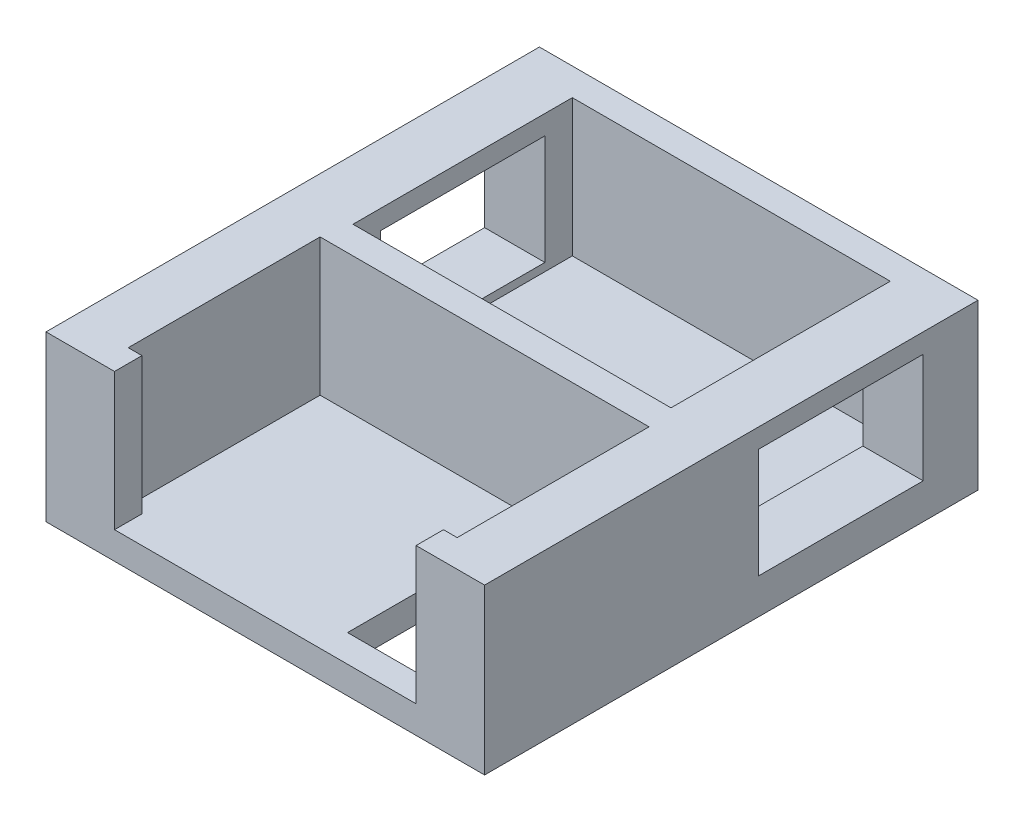
ISO-10303-21;
HEADER;
FILE_DESCRIPTION(('STEP AP214'),'2;1');
FILE_NAME('part.step','',(''),(''),'','','');
FILE_SCHEMA(('AUTOMOTIVE_DESIGN { 1 0 10303 214 1 1 1 1 }'));
ENDSEC;
DATA;
#1=APPLICATION_CONTEXT('core data for automotive mechanical design processes');
#2=APPLICATION_PROTOCOL_DEFINITION('international standard','automotive_design',2000,#1);
#3=PRODUCT_CONTEXT('',#1,'mechanical');
#4=PRODUCT('Part','Part','',(#3));
#5=PRODUCT_RELATED_PRODUCT_CATEGORY('part','',(#4));
#6=PRODUCT_DEFINITION_FORMATION('','',#4);
#7=PRODUCT_DEFINITION_CONTEXT('part definition',#1,'design');
#8=PRODUCT_DEFINITION('design','',#6,#7);
#9=PRODUCT_DEFINITION_SHAPE('','',#8);
#10=(LENGTH_UNIT() NAMED_UNIT(*) SI_UNIT(.MILLI.,.METRE.));
#11=(NAMED_UNIT(*) PLANE_ANGLE_UNIT() SI_UNIT($,.RADIAN.));
#12=(NAMED_UNIT(*) SI_UNIT($,.STERADIAN.) SOLID_ANGLE_UNIT());
#13=UNCERTAINTY_MEASURE_WITH_UNIT(LENGTH_MEASURE(1.E-05),#10,'distance_accuracy_value','');
#14=(GEOMETRIC_REPRESENTATION_CONTEXT(3) GLOBAL_UNCERTAINTY_ASSIGNED_CONTEXT((#13)) GLOBAL_UNIT_ASSIGNED_CONTEXT((#10,
#11,#12)) REPRESENTATION_CONTEXT('',''));
#15=CARTESIAN_POINT('',(0.,0.,0.));
#16=DIRECTION('',(0.,0.,1.));
#17=DIRECTION('',(1.,0.,0.));
#18=AXIS2_PLACEMENT_3D('',#15,#16,#17);
#19=CARTESIAN_POINT('',(32.3529411764706,30.,80.7124020072625));
#20=DIRECTION('',(0.,0.,-1.));
#21=DIRECTION('',(-1.,0.,0.));
#22=AXIS2_PLACEMENT_3D('',#19,#20,#21);
#23=PLANE('',#22);
#24=DIRECTION('',(0.,-1.,0.));
#25=VECTOR('',#24,1.);
#26=CARTESIAN_POINT('',(29.8529411764706,30.,80.7124020072625));
#27=LINE('',#26,#25);
#28=CARTESIAN_POINT('',(29.8529411764706,30.,80.7124020072625));
#29=VERTEX_POINT('',#28);
#30=CARTESIAN_POINT('',(29.8529411764706,5.,80.7124020072625));
#31=VERTEX_POINT('',#30);
#32=EDGE_CURVE('E12',#29,#31,#27,.T.);
#33=ORIENTED_EDGE('',*,*,#32,.F.);
#34=DIRECTION('',(1.,0.,0.));
#35=VECTOR('',#34,1.);
#36=CARTESIAN_POINT('',(32.3529411764706,30.,80.7124020072625));
#37=LINE('',#36,#35);
#38=CARTESIAN_POINT('',(32.3529411764706,30.,80.7124020072625));
#39=VERTEX_POINT('',#38);
#40=EDGE_CURVE('E235',#29,#39,#37,.T.);
#41=ORIENTED_EDGE('',*,*,#40,.T.);
#42=DIRECTION('',(0.,-1.,0.));
#43=VECTOR('',#42,1.);
#44=CARTESIAN_POINT('',(32.3529411764706,30.,80.7124020072625));
#45=LINE('',#44,#43);
#46=CARTESIAN_POINT('',(32.3529411764706,0.,80.7124020072625));
#47=VERTEX_POINT('',#46);
#48=EDGE_CURVE('E381',#39,#47,#45,.T.);
#49=ORIENTED_EDGE('',*,*,#48,.T.);
#50=DIRECTION('',(1.,0.,0.));
#51=VECTOR('',#50,1.);
#52=CARTESIAN_POINT('',(32.3529411764706,0.,80.7124020072625));
#53=LINE('',#52,#51);
#54=CARTESIAN_POINT('',(12.3529411764706,0.,80.7124020072625));
#55=VERTEX_POINT('',#54);
#56=EDGE_CURVE('E529',#55,#47,#53,.T.);
#57=ORIENTED_EDGE('',*,*,#56,.F.);
#58=DIRECTION('',(0.,1.,0.));
#59=VECTOR('',#58,1.);
#60=CARTESIAN_POINT('',(12.3529411764706,0.,80.7124020072625));
#61=LINE('',#60,#59);
#62=CARTESIAN_POINT('',(12.3529411764706,5.,80.7124020072625));
#63=VERTEX_POINT('',#62);
#64=EDGE_CURVE('E535',#55,#63,#61,.T.);
#65=ORIENTED_EDGE('',*,*,#64,.T.);
#66=DIRECTION('',(-1.,0.,0.));
#67=VECTOR('',#66,1.);
#68=CARTESIAN_POINT('',(32.3529411764706,5.,80.7124020072625));
#69=LINE('',#68,#67);
#70=EDGE_CURVE('E499',#31,#63,#69,.T.);
#71=ORIENTED_EDGE('',*,*,#70,.F.);
#72=EDGE_LOOP('',(#33,#41,#49,#57,#65,#71));
#73=FACE_BOUND('',#72,.T.);
#74=ADVANCED_FACE('F41',(#73),#23,.T.);
#75=CARTESIAN_POINT('',(0.,5.,0.));
#76=DIRECTION('',(0.,1.,0.));
#77=DIRECTION('',(0.,0.,1.));
#78=AXIS2_PLACEMENT_3D('',#75,#76,#77);
#79=PLANE('',#78);
#80=CARTESIAN_POINT('',(16.3529411764706,5.,25.7124020072625));
#81=DIRECTION('',(0.,1.,0.));
#82=DIRECTION('',(0.,0.,1.));
#83=AXIS2_PLACEMENT_3D('',#80,#81,#82);
#84=CIRCLE('',#83,10.);
#85=CARTESIAN_POINT('',(16.3529411764706,5.,35.7124020072625));
#86=VERTEX_POINT('',#85);
#87=EDGE_CURVE('E259',#86,#86,#84,.T.);
#88=ORIENTED_EDGE('',*,*,#87,.F.);
#89=EDGE_LOOP('',(#88));
#90=FACE_BOUND('',#89,.T.);
#91=DIRECTION('',(-1.,0.,0.));
#92=VECTOR('',#91,1.);
#93=CARTESIAN_POINT('',(-26.6470588235294,5.,0.712402007262518));
#94=LINE('',#93,#92);
#95=CARTESIAN_POINT('',(31.3529411764706,5.,0.712402007262518));
#96=VERTEX_POINT('',#95);
#97=CARTESIAN_POINT('',(-26.6470588235294,5.,0.712402007262518));
#98=VERTEX_POINT('',#97);
#99=EDGE_CURVE('E408',#96,#98,#94,.T.);
#100=ORIENTED_EDGE('',*,*,#99,.T.);
#101=DIRECTION('',(0.,0.,1.));
#102=VECTOR('',#101,1.);
#103=CARTESIAN_POINT('',(-26.6470588235294,5.,0.712402007262518));
#104=LINE('',#103,#102);
#105=CARTESIAN_POINT('',(-26.6470588235294,5.,40.7124020072625));
#106=VERTEX_POINT('',#105);
#107=EDGE_CURVE('E403',#98,#106,#104,.T.);
#108=ORIENTED_EDGE('',*,*,#107,.T.);
#109=DIRECTION('',(1.,0.,0.));
#110=VECTOR('',#109,1.);
#111=CARTESIAN_POINT('',(-26.6470588235294,5.,40.7124020072625));
#112=LINE('',#111,#110);
#113=CARTESIAN_POINT('',(31.3529411764706,5.,40.7124020072625));
#114=VERTEX_POINT('',#113);
#115=EDGE_CURVE('E422',#106,#114,#112,.T.);
#116=ORIENTED_EDGE('',*,*,#115,.T.);
#117=DIRECTION('',(0.,0.,-1.));
#118=VECTOR('',#117,1.);
#119=CARTESIAN_POINT('',(31.3529411764706,5.,0.712402007262518));
#120=LINE('',#119,#118);
#121=EDGE_CURVE('E426',#114,#96,#120,.T.);
#122=ORIENTED_EDGE('',*,*,#121,.T.);
#123=EDGE_LOOP('',(#100,#108,#116,#122));
#124=FACE_BOUND('',#123,.T.);
#125=ADVANCED_FACE('F451',(#90,#124),#79,.T.);
#126=CARTESIAN_POINT('',(0.,0.,0.));
#127=DIRECTION('',(0.,1.,0.));
#128=DIRECTION('',(0.,0.,1.));
#129=AXIS2_PLACEMENT_3D('',#126,#127,#128);
#130=PLANE('',#129);
#131=ORIENTED_EDGE('',*,*,#56,.T.);
#132=DIRECTION('',(0.,0.,-1.));
#133=VECTOR('',#132,1.);
#134=CARTESIAN_POINT('',(32.3529411764706,0.,45.7124020072625));
#135=LINE('',#134,#133);
#136=CARTESIAN_POINT('',(32.3529411764706,0.,45.7124020072625));
#137=VERTEX_POINT('',#136);
#138=EDGE_CURVE('E517',#47,#137,#135,.T.);
#139=ORIENTED_EDGE('',*,*,#138,.T.);
#140=DIRECTION('',(-1.,0.,0.));
#141=VECTOR('',#140,1.);
#142=CARTESIAN_POINT('',(32.3529411764706,0.,45.7124020072625));
#143=LINE('',#142,#141);
#144=CARTESIAN_POINT('',(12.3529411764706,0.,45.7124020072625));
#145=VERTEX_POINT('',#144);
#146=EDGE_CURVE('E521',#137,#145,#143,.T.);
#147=ORIENTED_EDGE('',*,*,#146,.T.);
#148=DIRECTION('',(0.,0.,1.));
#149=VECTOR('',#148,1.);
#150=CARTESIAN_POINT('',(12.3529411764706,0.,45.7124020072625));
#151=LINE('',#150,#149);
#152=EDGE_CURVE('E525',#145,#55,#151,.T.);
#153=ORIENTED_EDGE('',*,*,#152,.T.);
#154=EDGE_LOOP('',(#131,#139,#147,#153));
#155=FACE_BOUND('',#154,.T.);
#156=DIRECTION('',(0.,0.,1.));
#157=VECTOR('',#156,1.);
#158=CARTESIAN_POINT('',(-37.6470588235294,0.,-14.2875979927375));
#159=LINE('',#158,#157);
#160=CARTESIAN_POINT('',(-37.6470588235294,0.,-4.28759799273748));
#161=VERTEX_POINT('',#160);
#162=CARTESIAN_POINT('',(-37.6470588235294,0.,85.7124020072625));
#163=VERTEX_POINT('',#162);
#164=EDGE_CURVE('E263',#161,#163,#159,.T.);
#165=ORIENTED_EDGE('',*,*,#164,.F.);
#166=DIRECTION('',(1.,0.,0.));
#167=VECTOR('',#166,1.);
#168=CARTESIAN_POINT('',(-37.6470588235294,0.,-4.28759799273748));
#169=LINE('',#168,#167);
#170=CARTESIAN_POINT('',(42.3529411764706,0.,-4.28759799273749));
#171=VERTEX_POINT('',#170);
#172=EDGE_CURVE('E352',#161,#171,#169,.T.);
#173=ORIENTED_EDGE('',*,*,#172,.T.);
#174=DIRECTION('',(0.,0.,-1.));
#175=VECTOR('',#174,1.);
#176=CARTESIAN_POINT('',(42.3529411764706,0.,-14.2875979927375));
#177=LINE('',#176,#175);
#178=CARTESIAN_POINT('',(42.3529411764706,0.,85.7124020072625));
#179=VERTEX_POINT('',#178);
#180=EDGE_CURVE('E272',#179,#171,#177,.T.);
#181=ORIENTED_EDGE('',*,*,#180,.F.);
#182=DIRECTION('',(1.,0.,0.));
#183=VECTOR('',#182,1.);
#184=CARTESIAN_POINT('',(-37.6470588235294,0.,85.7124020072625));
#185=LINE('',#184,#183);
#186=EDGE_CURVE('E269',#163,#179,#185,.T.);
#187=ORIENTED_EDGE('',*,*,#186,.F.);
#188=EDGE_LOOP('',(#165,#173,#181,#187));
#189=FACE_BOUND('',#188,.T.);
#190=CARTESIAN_POINT('',(16.3529411764706,0.,25.7124020072625));
#191=DIRECTION('',(0.,1.,0.));
#192=DIRECTION('',(0.,0.,1.));
#193=AXIS2_PLACEMENT_3D('',#190,#191,#192);
#194=CIRCLE('',#193,10.);
#195=CARTESIAN_POINT('',(16.3529411764706,0.,35.7124020072625));
#196=VERTEX_POINT('',#195);
#197=EDGE_CURVE('E258',#196,#196,#194,.T.);
#198=ORIENTED_EDGE('',*,*,#197,.T.);
#199=EDGE_LOOP('',(#198));
#200=FACE_BOUND('',#199,.T.);
#201=ADVANCED_FACE('F476',(#155,#189,#200),#130,.F.);
#202=CARTESIAN_POINT('',(-37.6470588235294,5.,-14.2875979927375));
#203=DIRECTION('',(1.,0.,0.));
#204=DIRECTION('',(0.,0.,-1.));
#205=AXIS2_PLACEMENT_3D('',#202,#203,#204);
#206=PLANE('',#205);
#207=DIRECTION('',(0.,0.,1.));
#208=VECTOR('',#207,1.);
#209=CARTESIAN_POINT('',(-37.6470588235294,26.4657660728318,35.7124020072625));
#210=LINE('',#209,#208);
#211=CARTESIAN_POINT('',(-37.6470588235294,26.4657660728318,5.71240200726252));
#212=VERTEX_POINT('',#211);
#213=CARTESIAN_POINT('',(-37.6470588235294,26.4657660728318,35.7124020072625));
#214=VERTEX_POINT('',#213);
#215=EDGE_CURVE('E554',#212,#214,#210,.T.);
#216=ORIENTED_EDGE('',*,*,#215,.T.);
#217=DIRECTION('',(0.,-1.,0.));
#218=VECTOR('',#217,1.);
#219=CARTESIAN_POINT('',(-37.6470588235294,26.4657660728318,35.7124020072625));
#220=LINE('',#219,#218);
#221=CARTESIAN_POINT('',(-37.6470588235294,6.4657660728318,35.7124020072625));
#222=VERTEX_POINT('',#221);
#223=EDGE_CURVE('E542',#214,#222,#220,.T.);
#224=ORIENTED_EDGE('',*,*,#223,.T.);
#225=DIRECTION('',(0.,0.,-1.));
#226=VECTOR('',#225,1.);
#227=CARTESIAN_POINT('',(-37.6470588235294,6.4657660728318,35.7124020072625));
#228=LINE('',#227,#226);
#229=CARTESIAN_POINT('',(-37.6470588235294,6.4657660728318,5.71240200726251));
#230=VERTEX_POINT('',#229);
#231=EDGE_CURVE('E546',#222,#230,#228,.T.);
#232=ORIENTED_EDGE('',*,*,#231,.T.);
#233=DIRECTION('',(0.,1.,0.));
#234=VECTOR('',#233,1.);
#235=CARTESIAN_POINT('',(-37.6470588235294,26.4657660728318,5.71240200726252));
#236=LINE('',#235,#234);
#237=EDGE_CURVE('E550',#230,#212,#236,.T.);
#238=ORIENTED_EDGE('',*,*,#237,.T.);
#239=EDGE_LOOP('',(#216,#224,#232,#238));
#240=FACE_BOUND('',#239,.T.);
#241=DIRECTION('',(0.,0.,1.));
#242=VECTOR('',#241,1.);
#243=CARTESIAN_POINT('',(-37.6470588235294,30.,-14.2875979927375));
#244=LINE('',#243,#242);
#245=CARTESIAN_POINT('',(-37.6470588235294,30.,-4.28759799273748));
#246=VERTEX_POINT('',#245);
#247=CARTESIAN_POINT('',(-37.6470588235294,30.,85.7124020072625));
#248=VERTEX_POINT('',#247);
#249=EDGE_CURVE('E246',#246,#248,#244,.T.);
#250=ORIENTED_EDGE('',*,*,#249,.F.);
#251=DIRECTION('',(0.,1.,0.));
#252=VECTOR('',#251,1.);
#253=CARTESIAN_POINT('',(-37.6470588235294,0.,-4.28759799273748));
#254=LINE('',#253,#252);
#255=EDGE_CURVE('E356',#161,#246,#254,.T.);
#256=ORIENTED_EDGE('',*,*,#255,.F.);
#257=ORIENTED_EDGE('',*,*,#164,.T.);
#258=DIRECTION('',(0.,-1.,0.));
#259=VECTOR('',#258,1.);
#260=CARTESIAN_POINT('',(-37.6470588235294,5.,85.7124020072625));
#261=LINE('',#260,#259);
#262=EDGE_CURVE('E278',#248,#163,#261,.T.);
#263=ORIENTED_EDGE('',*,*,#262,.F.);
#264=EDGE_LOOP('',(#250,#256,#257,#263));
#265=FACE_BOUND('',#264,.T.);
#266=ADVANCED_FACE('F43',(#240,#265),#206,.F.);
#267=CARTESIAN_POINT('',(-37.6470588235294,5.,85.7124020072625));
#268=DIRECTION('',(0.,0.,-1.));
#269=DIRECTION('',(-1.,0.,0.));
#270=AXIS2_PLACEMENT_3D('',#267,#268,#269);
#271=PLANE('',#270);
#272=DIRECTION('',(1.,0.,0.));
#273=VECTOR('',#272,1.);
#274=CARTESIAN_POINT('',(-37.6470588235294,30.,85.7124020072625));
#275=LINE('',#274,#273);
#276=CARTESIAN_POINT('',(29.8529411764706,30.,85.7124020072625));
#277=VERTEX_POINT('',#276);
#278=CARTESIAN_POINT('',(42.3529411764706,30.,85.7124020072625));
#279=VERTEX_POINT('',#278);
#280=EDGE_CURVE('E232',#277,#279,#275,.T.);
#281=ORIENTED_EDGE('',*,*,#280,.F.);
#282=DIRECTION('',(0.,1.,0.));
#283=VECTOR('',#282,1.);
#284=CARTESIAN_POINT('',(29.8529411764706,30.,85.7124020072625));
#285=LINE('',#284,#283);
#286=CARTESIAN_POINT('',(29.8529411764706,5.,85.7124020072625));
#287=VERTEX_POINT('',#286);
#288=EDGE_CURVE('E213',#287,#277,#285,.T.);
#289=ORIENTED_EDGE('',*,*,#288,.F.);
#290=DIRECTION('',(1.,0.,0.));
#291=VECTOR('',#290,1.);
#292=CARTESIAN_POINT('',(29.8529411764706,5.,85.7124020072625));
#293=LINE('',#292,#291);
#294=CARTESIAN_POINT('',(-25.1470588235294,4.99999999999999,85.7124020072625));
#295=VERTEX_POINT('',#294);
#296=EDGE_CURVE('E238',#295,#287,#293,.T.);
#297=ORIENTED_EDGE('',*,*,#296,.F.);
#298=DIRECTION('',(0.,-1.,0.));
#299=VECTOR('',#298,1.);
#300=CARTESIAN_POINT('',(-25.1470588235294,30.,85.7124020072625));
#301=LINE('',#300,#299);
#302=CARTESIAN_POINT('',(-25.1470588235294,30.,85.7124020072625));
#303=VERTEX_POINT('',#302);
#304=EDGE_CURVE('E225',#303,#295,#301,.T.);
#305=ORIENTED_EDGE('',*,*,#304,.F.);
#306=EDGE_CURVE('E245',#248,#303,#275,.T.);
#307=ORIENTED_EDGE('',*,*,#306,.F.);
#308=ORIENTED_EDGE('',*,*,#262,.T.);
#309=ORIENTED_EDGE('',*,*,#186,.T.);
#310=DIRECTION('',(0.,-1.,0.));
#311=VECTOR('',#310,1.);
#312=CARTESIAN_POINT('',(42.3529411764706,5.,85.7124020072625));
#313=LINE('',#312,#311);
#314=EDGE_CURVE('E242',#279,#179,#313,.T.);
#315=ORIENTED_EDGE('',*,*,#314,.F.);
#316=EDGE_LOOP('',(#281,#289,#297,#305,#307,#308,#309,#315));
#317=FACE_BOUND('',#316,.T.);
#318=ADVANCED_FACE('F240',(#317),#271,.F.);
#319=CARTESIAN_POINT('',(42.3529411764706,5.,-14.2875979927375));
#320=DIRECTION('',(-1.,0.,0.));
#321=DIRECTION('',(0.,0.,1.));
#322=AXIS2_PLACEMENT_3D('',#319,#320,#321);
#323=PLANE('',#322);
#324=DIRECTION('',(0.,0.,-1.));
#325=VECTOR('',#324,1.);
#326=CARTESIAN_POINT('',(42.3529411764706,6.4657660728318,35.7124020072625));
#327=LINE('',#326,#325);
#328=CARTESIAN_POINT('',(42.3529411764706,6.4657660728318,35.7124020072625));
#329=VERTEX_POINT('',#328);
#330=CARTESIAN_POINT('',(42.3529411764706,6.4657660728318,5.71240200726251));
#331=VERTEX_POINT('',#330);
#332=EDGE_CURVE('E560',#329,#331,#327,.T.);
#333=ORIENTED_EDGE('',*,*,#332,.F.);
#334=DIRECTION('',(0.,-1.,0.));
#335=VECTOR('',#334,1.);
#336=CARTESIAN_POINT('',(42.3529411764706,26.4657660728318,35.7124020072625));
#337=LINE('',#336,#335);
#338=CARTESIAN_POINT('',(42.3529411764706,26.4657660728318,35.7124020072625));
#339=VERTEX_POINT('',#338);
#340=EDGE_CURVE('E539',#339,#329,#337,.T.);
#341=ORIENTED_EDGE('',*,*,#340,.F.);
#342=DIRECTION('',(0.,0.,1.));
#343=VECTOR('',#342,1.);
#344=CARTESIAN_POINT('',(42.3529411764706,26.4657660728318,35.7124020072625));
#345=LINE('',#344,#343);
#346=CARTESIAN_POINT('',(42.3529411764706,26.4657660728318,5.71240200726251));
#347=VERTEX_POINT('',#346);
#348=EDGE_CURVE('E308',#347,#339,#345,.T.);
#349=ORIENTED_EDGE('',*,*,#348,.F.);
#350=DIRECTION('',(0.,1.,0.));
#351=VECTOR('',#350,1.);
#352=CARTESIAN_POINT('',(42.3529411764706,26.4657660728318,5.71240200726251));
#353=LINE('',#352,#351);
#354=EDGE_CURVE('E324',#331,#347,#353,.T.);
#355=ORIENTED_EDGE('',*,*,#354,.F.);
#356=EDGE_LOOP('',(#333,#341,#349,#355));
#357=FACE_BOUND('',#356,.T.);
#358=ORIENTED_EDGE('',*,*,#180,.T.);
#359=DIRECTION('',(0.,1.,0.));
#360=VECTOR('',#359,1.);
#361=CARTESIAN_POINT('',(42.3529411764706,0.,-4.28759799273749));
#362=LINE('',#361,#360);
#363=CARTESIAN_POINT('',(42.3529411764706,30.,-4.28759799273749));
#364=VERTEX_POINT('',#363);
#365=EDGE_CURVE('E359',#171,#364,#362,.T.);
#366=ORIENTED_EDGE('',*,*,#365,.T.);
#367=DIRECTION('',(0.,0.,-1.));
#368=VECTOR('',#367,1.);
#369=CARTESIAN_POINT('',(42.3529411764706,30.,-14.2875979927375));
#370=LINE('',#369,#368);
#371=EDGE_CURVE('E251',#279,#364,#370,.T.);
#372=ORIENTED_EDGE('',*,*,#371,.F.);
#373=ORIENTED_EDGE('',*,*,#314,.T.);
#374=EDGE_LOOP('',(#358,#366,#372,#373));
#375=FACE_BOUND('',#374,.T.);
#376=ADVANCED_FACE('F630',(#357,#375),#323,.F.);
#377=CARTESIAN_POINT('',(16.3529411764706,5.,25.7124020072625));
#378=DIRECTION('',(0.,-1.,0.));
#379=DIRECTION('',(0.,0.,-1.));
#380=AXIS2_PLACEMENT_3D('',#377,#378,#379);
#381=CYLINDRICAL_SURFACE('',#380,10.);
#382=ORIENTED_EDGE('',*,*,#87,.T.);
#383=EDGE_LOOP('',(#382));
#384=FACE_BOUND('',#383,.T.);
#385=ORIENTED_EDGE('',*,*,#197,.F.);
#386=EDGE_LOOP('',(#385));
#387=FACE_BOUND('',#386,.T.);
#388=ADVANCED_FACE('F649',(#384,#387),#381,.F.);
#389=CARTESIAN_POINT('',(0.,30.,0.));
#390=DIRECTION('',(0.,1.,0.));
#391=DIRECTION('',(0.,0.,1.));
#392=AXIS2_PLACEMENT_3D('',#389,#390,#391);
#393=PLANE('',#392);
#394=DIRECTION('',(0.,0.,1.));
#395=VECTOR('',#394,1.);
#396=CARTESIAN_POINT('',(29.8529411764706,30.,75.7124020072625));
#397=LINE('',#396,#395);
#398=EDGE_CURVE('E216',#29,#277,#397,.T.);
#399=ORIENTED_EDGE('',*,*,#398,.T.);
#400=ORIENTED_EDGE('',*,*,#280,.T.);
#401=ORIENTED_EDGE('',*,*,#371,.T.);
#402=DIRECTION('',(1.,0.,0.));
#403=VECTOR('',#402,1.);
#404=CARTESIAN_POINT('',(-37.6470588235294,30.,-4.28759799273748));
#405=LINE('',#404,#403);
#406=EDGE_CURVE('E351',#246,#364,#405,.T.);
#407=ORIENTED_EDGE('',*,*,#406,.F.);
#408=ORIENTED_EDGE('',*,*,#249,.T.);
#409=ORIENTED_EDGE('',*,*,#306,.T.);
#410=DIRECTION('',(0.,0.,1.));
#411=VECTOR('',#410,1.);
#412=CARTESIAN_POINT('',(-25.1470588235294,30.,75.7124020072625));
#413=LINE('',#412,#411);
#414=CARTESIAN_POINT('',(-25.1470588235294,30.,80.7124020072625));
#415=VERTEX_POINT('',#414);
#416=EDGE_CURVE('E237',#415,#303,#413,.T.);
#417=ORIENTED_EDGE('',*,*,#416,.F.);
#418=CARTESIAN_POINT('',(-27.6470588235294,30.,80.7124020072625));
#419=VERTEX_POINT('',#418);
#420=EDGE_CURVE('E377',#419,#415,#37,.T.);
#421=ORIENTED_EDGE('',*,*,#420,.F.);
#422=DIRECTION('',(0.,0.,1.));
#423=VECTOR('',#422,1.);
#424=CARTESIAN_POINT('',(-27.6470588235294,30.,45.7124020072625));
#425=LINE('',#424,#423);
#426=CARTESIAN_POINT('',(-27.6470588235294,30.,45.7124020072625));
#427=VERTEX_POINT('',#426);
#428=EDGE_CURVE('E373',#427,#419,#425,.T.);
#429=ORIENTED_EDGE('',*,*,#428,.F.);
#430=DIRECTION('',(-1.,0.,0.));
#431=VECTOR('',#430,1.);
#432=CARTESIAN_POINT('',(32.3529411764706,30.,45.7124020072625));
#433=LINE('',#432,#431);
#434=CARTESIAN_POINT('',(32.3529411764706,30.,45.7124020072625));
#435=VERTEX_POINT('',#434);
#436=EDGE_CURVE('E369',#435,#427,#433,.T.);
#437=ORIENTED_EDGE('',*,*,#436,.F.);
#438=DIRECTION('',(0.,0.,-1.));
#439=VECTOR('',#438,1.);
#440=CARTESIAN_POINT('',(32.3529411764706,30.,45.7124020072625));
#441=LINE('',#440,#439);
#442=EDGE_CURVE('E366',#39,#435,#441,.T.);
#443=ORIENTED_EDGE('',*,*,#442,.F.);
#444=ORIENTED_EDGE('',*,*,#40,.F.);
#445=EDGE_LOOP('',(#399,#400,#401,#407,#408,#409,#417,#421,#429,#437,#443,#444));
#446=FACE_BOUND('',#445,.T.);
#447=DIRECTION('',(1.,0.,0.));
#448=VECTOR('',#447,1.);
#449=CARTESIAN_POINT('',(-26.6470588235294,30.,40.7124020072625));
#450=LINE('',#449,#448);
#451=CARTESIAN_POINT('',(-26.6470588235294,30.,40.7124020072625));
#452=VERTEX_POINT('',#451);
#453=CARTESIAN_POINT('',(31.3529411764706,30.,40.7124020072625));
#454=VERTEX_POINT('',#453);
#455=EDGE_CURVE('E407',#452,#454,#450,.T.);
#456=ORIENTED_EDGE('',*,*,#455,.F.);
#457=DIRECTION('',(0.,0.,1.));
#458=VECTOR('',#457,1.);
#459=CARTESIAN_POINT('',(-26.6470588235294,30.,0.712402007262518));
#460=LINE('',#459,#458);
#461=CARTESIAN_POINT('',(-26.6470588235294,30.,0.712402007262518));
#462=VERTEX_POINT('',#461);
#463=EDGE_CURVE('E404',#462,#452,#460,.T.);
#464=ORIENTED_EDGE('',*,*,#463,.F.);
#465=DIRECTION('',(-1.,0.,0.));
#466=VECTOR('',#465,1.);
#467=CARTESIAN_POINT('',(-26.6470588235294,30.,0.712402007262518));
#468=LINE('',#467,#466);
#469=CARTESIAN_POINT('',(31.3529411764706,30.,0.712402007262518));
#470=VERTEX_POINT('',#469);
#471=EDGE_CURVE('E415',#470,#462,#468,.T.);
#472=ORIENTED_EDGE('',*,*,#471,.F.);
#473=DIRECTION('',(0.,0.,-1.));
#474=VECTOR('',#473,1.);
#475=CARTESIAN_POINT('',(31.3529411764706,30.,0.712402007262518));
#476=LINE('',#475,#474);
#477=EDGE_CURVE('E411',#454,#470,#476,.T.);
#478=ORIENTED_EDGE('',*,*,#477,.F.);
#479=EDGE_LOOP('',(#456,#464,#472,#478));
#480=FACE_BOUND('',#479,.T.);
#481=ADVANCED_FACE('F229',(#446,#480),#393,.T.);
#482=CARTESIAN_POINT('',(-26.6470588235294,30.,0.712402007262518));
#483=DIRECTION('',(1.,0.,0.));
#484=DIRECTION('',(0.,0.,-1.));
#485=AXIS2_PLACEMENT_3D('',#482,#483,#484);
#486=PLANE('',#485);
#487=DIRECTION('',(0.,-1.,0.));
#488=VECTOR('',#487,1.);
#489=CARTESIAN_POINT('',(-26.6470588235294,30.,35.7124020072625));
#490=LINE('',#489,#488);
#491=CARTESIAN_POINT('',(-26.6470588235294,26.4657660728318,35.7124020072625));
#492=VERTEX_POINT('',#491);
#493=CARTESIAN_POINT('',(-26.6470588235294,6.4657660728318,35.7124020072625));
#494=VERTEX_POINT('',#493);
#495=EDGE_CURVE('E347',#492,#494,#490,.T.);
#496=ORIENTED_EDGE('',*,*,#495,.F.);
#497=DIRECTION('',(0.,0.,1.));
#498=VECTOR('',#497,1.);
#499=CARTESIAN_POINT('',(-26.6470588235294,26.4657660728318,0.712402007262518));
#500=LINE('',#499,#498);
#501=CARTESIAN_POINT('',(-26.6470588235294,26.4657660728318,5.71240200726252));
#502=VERTEX_POINT('',#501);
#503=EDGE_CURVE('E344',#502,#492,#500,.T.);
#504=ORIENTED_EDGE('',*,*,#503,.F.);
#505=DIRECTION('',(0.,1.,0.));
#506=VECTOR('',#505,1.);
#507=CARTESIAN_POINT('',(-26.6470588235294,30.,5.71240200726252));
#508=LINE('',#507,#506);
#509=CARTESIAN_POINT('',(-26.6470588235294,6.4657660728318,5.71240200726251));
#510=VERTEX_POINT('',#509);
#511=EDGE_CURVE('E341',#510,#502,#508,.T.);
#512=ORIENTED_EDGE('',*,*,#511,.F.);
#513=DIRECTION('',(0.,0.,-1.));
#514=VECTOR('',#513,1.);
#515=CARTESIAN_POINT('',(-26.6470588235294,6.4657660728318,0.712402007262517));
#516=LINE('',#515,#514);
#517=EDGE_CURVE('E338',#494,#510,#516,.T.);
#518=ORIENTED_EDGE('',*,*,#517,.F.);
#519=EDGE_LOOP('',(#496,#504,#512,#518));
#520=FACE_BOUND('',#519,.T.);
#521=ORIENTED_EDGE('',*,*,#107,.F.);
#522=DIRECTION('',(0.,-1.,0.));
#523=VECTOR('',#522,1.);
#524=CARTESIAN_POINT('',(-26.6470588235294,30.,0.712402007262518));
#525=LINE('',#524,#523);
#526=EDGE_CURVE('E418',#462,#98,#525,.T.);
#527=ORIENTED_EDGE('',*,*,#526,.F.);
#528=ORIENTED_EDGE('',*,*,#463,.T.);
#529=DIRECTION('',(0.,-1.,0.));
#530=VECTOR('',#529,1.);
#531=CARTESIAN_POINT('',(-26.6470588235294,30.,40.7124020072625));
#532=LINE('',#531,#530);
#533=EDGE_CURVE('E252',#452,#106,#532,.T.);
#534=ORIENTED_EDGE('',*,*,#533,.T.);
#535=EDGE_LOOP('',(#521,#527,#528,#534));
#536=FACE_BOUND('',#535,.T.);
#537=ADVANCED_FACE('F445',(#520,#536),#486,.T.);
#538=CARTESIAN_POINT('',(-26.6470588235294,30.,40.7124020072625));
#539=DIRECTION('',(0.,0.,-1.));
#540=DIRECTION('',(-1.,0.,0.));
#541=AXIS2_PLACEMENT_3D('',#538,#539,#540);
#542=PLANE('',#541);
#543=ORIENTED_EDGE('',*,*,#115,.F.);
#544=ORIENTED_EDGE('',*,*,#533,.F.);
#545=ORIENTED_EDGE('',*,*,#455,.T.);
#546=DIRECTION('',(0.,-1.,0.));
#547=VECTOR('',#546,1.);
#548=CARTESIAN_POINT('',(31.3529411764706,30.,40.7124020072625));
#549=LINE('',#548,#547);
#550=EDGE_CURVE('E438',#454,#114,#549,.T.);
#551=ORIENTED_EDGE('',*,*,#550,.T.);
#552=EDGE_LOOP('',(#543,#544,#545,#551));
#553=FACE_BOUND('',#552,.T.);
#554=ADVANCED_FACE('F459',(#553),#542,.T.);
#555=CARTESIAN_POINT('',(31.3529411764706,30.,0.712402007262518));
#556=DIRECTION('',(-1.,0.,0.));
#557=DIRECTION('',(0.,0.,1.));
#558=AXIS2_PLACEMENT_3D('',#555,#556,#557);
#559=PLANE('',#558);
#560=DIRECTION('',(0.,1.,0.));
#561=VECTOR('',#560,1.);
#562=CARTESIAN_POINT('',(31.3529411764706,30.,35.7124020072625));
#563=LINE('',#562,#561);
#564=CARTESIAN_POINT('',(31.3529411764706,6.4657660728318,35.7124020072625));
#565=VERTEX_POINT('',#564);
#566=CARTESIAN_POINT('',(31.3529411764706,26.4657660728318,35.7124020072625));
#567=VERTEX_POINT('',#566);
#568=EDGE_CURVE('E50',#565,#567,#563,.T.);
#569=ORIENTED_EDGE('',*,*,#568,.F.);
#570=DIRECTION('',(0.,0.,1.));
#571=VECTOR('',#570,1.);
#572=CARTESIAN_POINT('',(31.3529411764706,6.4657660728318,0.712402007262517));
#573=LINE('',#572,#571);
#574=CARTESIAN_POINT('',(31.3529411764706,6.4657660728318,5.71240200726251));
#575=VERTEX_POINT('',#574);
#576=EDGE_CURVE('E282',#575,#565,#573,.T.);
#577=ORIENTED_EDGE('',*,*,#576,.F.);
#578=DIRECTION('',(0.,-1.,0.));
#579=VECTOR('',#578,1.);
#580=CARTESIAN_POINT('',(31.3529411764706,30.,5.71240200726252));
#581=LINE('',#580,#579);
#582=CARTESIAN_POINT('',(31.3529411764706,26.4657660728318,5.71240200726251));
#583=VERTEX_POINT('',#582);
#584=EDGE_CURVE('E285',#583,#575,#581,.T.);
#585=ORIENTED_EDGE('',*,*,#584,.F.);
#586=DIRECTION('',(0.,0.,-1.));
#587=VECTOR('',#586,1.);
#588=CARTESIAN_POINT('',(31.3529411764706,26.4657660728318,0.712402007262518));
#589=LINE('',#588,#587);
#590=EDGE_CURVE('E289',#567,#583,#589,.T.);
#591=ORIENTED_EDGE('',*,*,#590,.F.);
#592=EDGE_LOOP('',(#569,#577,#585,#591));
#593=FACE_BOUND('',#592,.T.);
#594=ORIENTED_EDGE('',*,*,#121,.F.);
#595=ORIENTED_EDGE('',*,*,#550,.F.);
#596=ORIENTED_EDGE('',*,*,#477,.T.);
#597=DIRECTION('',(0.,-1.,0.));
#598=VECTOR('',#597,1.);
#599=CARTESIAN_POINT('',(31.3529411764706,30.,0.712402007262518));
#600=LINE('',#599,#598);
#601=EDGE_CURVE('E435',#470,#96,#600,.T.);
#602=ORIENTED_EDGE('',*,*,#601,.T.);
#603=EDGE_LOOP('',(#594,#595,#596,#602));
#604=FACE_BOUND('',#603,.T.);
#605=ADVANCED_FACE('F315',(#593,#604),#559,.T.);
#606=CARTESIAN_POINT('',(-26.6470588235294,30.,0.712402007262518));
#607=DIRECTION('',(0.,0.,1.));
#608=DIRECTION('',(1.,0.,0.));
#609=AXIS2_PLACEMENT_3D('',#606,#607,#608);
#610=PLANE('',#609);
#611=ORIENTED_EDGE('',*,*,#99,.F.);
#612=ORIENTED_EDGE('',*,*,#601,.F.);
#613=ORIENTED_EDGE('',*,*,#471,.T.);
#614=ORIENTED_EDGE('',*,*,#526,.T.);
#615=EDGE_LOOP('',(#611,#612,#613,#614));
#616=FACE_BOUND('',#615,.T.);
#617=ADVANCED_FACE('F455',(#616),#610,.T.);
#618=CARTESIAN_POINT('',(32.3529411764706,30.,45.7124020072625));
#619=DIRECTION('',(-1.,0.,0.));
#620=DIRECTION('',(0.,0.,1.));
#621=AXIS2_PLACEMENT_3D('',#618,#619,#620);
#622=PLANE('',#621);
#623=DIRECTION('',(0.,-1.,0.));
#624=VECTOR('',#623,1.);
#625=CARTESIAN_POINT('',(32.3529411764706,30.,45.7124020072625));
#626=LINE('',#625,#624);
#627=EDGE_CURVE('E400',#435,#137,#626,.T.);
#628=ORIENTED_EDGE('',*,*,#627,.T.);
#629=ORIENTED_EDGE('',*,*,#138,.F.);
#630=ORIENTED_EDGE('',*,*,#48,.F.);
#631=ORIENTED_EDGE('',*,*,#442,.T.);
#632=EDGE_LOOP('',(#628,#629,#630,#631));
#633=FACE_BOUND('',#632,.T.);
#634=ADVANCED_FACE('F466',(#633),#622,.T.);
#635=CARTESIAN_POINT('',(32.3529411764706,30.,45.7124020072625));
#636=DIRECTION('',(0.,0.,1.));
#637=DIRECTION('',(1.,0.,0.));
#638=AXIS2_PLACEMENT_3D('',#635,#636,#637);
#639=PLANE('',#638);
#640=DIRECTION('',(-1.,0.,0.));
#641=VECTOR('',#640,1.);
#642=CARTESIAN_POINT('',(32.3529411764706,5.,45.7124020072625));
#643=LINE('',#642,#641);
#644=CARTESIAN_POINT('',(12.3529411764706,5.,45.7124020072625));
#645=VERTEX_POINT('',#644);
#646=CARTESIAN_POINT('',(-27.6470588235294,5.,45.7124020072625));
#647=VERTEX_POINT('',#646);
#648=EDGE_CURVE('E363',#645,#647,#643,.T.);
#649=ORIENTED_EDGE('',*,*,#648,.F.);
#650=DIRECTION('',(0.,1.,0.));
#651=VECTOR('',#650,1.);
#652=CARTESIAN_POINT('',(12.3529411764706,0.,45.7124020072625));
#653=LINE('',#652,#651);
#654=EDGE_CURVE('E65',#145,#645,#653,.T.);
#655=ORIENTED_EDGE('',*,*,#654,.F.);
#656=ORIENTED_EDGE('',*,*,#146,.F.);
#657=ORIENTED_EDGE('',*,*,#627,.F.);
#658=ORIENTED_EDGE('',*,*,#436,.T.);
#659=DIRECTION('',(0.,-1.,0.));
#660=VECTOR('',#659,1.);
#661=CARTESIAN_POINT('',(-27.6470588235294,30.,45.7124020072625));
#662=LINE('',#661,#660);
#663=EDGE_CURVE('E396',#427,#647,#662,.T.);
#664=ORIENTED_EDGE('',*,*,#663,.T.);
#665=EDGE_LOOP('',(#649,#655,#656,#657,#658,#664));
#666=FACE_BOUND('',#665,.T.);
#667=ADVANCED_FACE('F491',(#666),#639,.T.);
#668=CARTESIAN_POINT('',(-27.6470588235294,30.,45.7124020072625));
#669=DIRECTION('',(1.,0.,0.));
#670=DIRECTION('',(0.,0.,-1.));
#671=AXIS2_PLACEMENT_3D('',#668,#669,#670);
#672=PLANE('',#671);
#673=DIRECTION('',(0.,0.,1.));
#674=VECTOR('',#673,1.);
#675=CARTESIAN_POINT('',(-27.6470588235294,5.,45.7124020072625));
#676=LINE('',#675,#674);
#677=CARTESIAN_POINT('',(-27.6470588235294,5.,80.7124020072625));
#678=VERTEX_POINT('',#677);
#679=EDGE_CURVE('E384',#647,#678,#676,.T.);
#680=ORIENTED_EDGE('',*,*,#679,.F.);
#681=ORIENTED_EDGE('',*,*,#663,.F.);
#682=ORIENTED_EDGE('',*,*,#428,.T.);
#683=DIRECTION('',(0.,-1.,0.));
#684=VECTOR('',#683,1.);
#685=CARTESIAN_POINT('',(-27.6470588235294,30.,80.7124020072625));
#686=LINE('',#685,#684);
#687=EDGE_CURVE('E393',#419,#678,#686,.T.);
#688=ORIENTED_EDGE('',*,*,#687,.T.);
#689=EDGE_LOOP('',(#680,#681,#682,#688));
#690=FACE_BOUND('',#689,.T.);
#691=ADVANCED_FACE('F483',(#690),#672,.T.);
#692=DIRECTION('',(0.,1.,0.));
#693=VECTOR('',#692,1.);
#694=CARTESIAN_POINT('',(-25.1470588235294,30.,80.7124020072625));
#695=LINE('',#694,#693);
#696=CARTESIAN_POINT('',(-25.1470588235294,5.,80.7124020072625));
#697=VERTEX_POINT('',#696);
#698=EDGE_CURVE('E494',#697,#415,#695,.T.);
#699=ORIENTED_EDGE('',*,*,#698,.F.);
#700=DIRECTION('',(1.,0.,0.));
#701=VECTOR('',#700,1.);
#702=CARTESIAN_POINT('',(32.3529411764706,5.,80.7124020072625));
#703=LINE('',#702,#701);
#704=EDGE_CURVE('E370',#678,#697,#703,.T.);
#705=ORIENTED_EDGE('',*,*,#704,.F.);
#706=ORIENTED_EDGE('',*,*,#687,.F.);
#707=ORIENTED_EDGE('',*,*,#420,.T.);
#708=EDGE_LOOP('',(#699,#705,#706,#707));
#709=FACE_BOUND('',#708,.T.);
#710=ADVANCED_FACE('F472',(#709),#23,.T.);
#711=ORIENTED_EDGE('',*,*,#704,.T.);
#712=DIRECTION('',(0.,0.,1.));
#713=VECTOR('',#712,1.);
#714=CARTESIAN_POINT('',(-25.1470588235294,4.99999999999999,75.7124020072625));
#715=LINE('',#714,#713);
#716=EDGE_CURVE('E57',#697,#295,#715,.T.);
#717=ORIENTED_EDGE('',*,*,#716,.T.);
#718=ORIENTED_EDGE('',*,*,#296,.T.);
#719=DIRECTION('',(0.,0.,1.));
#720=VECTOR('',#719,1.);
#721=CARTESIAN_POINT('',(29.8529411764706,5.,75.7124020072625));
#722=LINE('',#721,#720);
#723=EDGE_CURVE('E219',#31,#287,#722,.T.);
#724=ORIENTED_EDGE('',*,*,#723,.F.);
#725=ORIENTED_EDGE('',*,*,#70,.T.);
#726=DIRECTION('',(0.,0.,1.));
#727=VECTOR('',#726,1.);
#728=CARTESIAN_POINT('',(12.3529411764706,5.,45.7124020072625));
#729=LINE('',#728,#727);
#730=EDGE_CURVE('E498',#645,#63,#729,.T.);
#731=ORIENTED_EDGE('',*,*,#730,.F.);
#732=ORIENTED_EDGE('',*,*,#648,.T.);
#733=ORIENTED_EDGE('',*,*,#679,.T.);
#734=EDGE_LOOP('',(#711,#717,#718,#724,#725,#731,#732,#733));
#735=FACE_BOUND('',#734,.T.);
#736=ADVANCED_FACE('F479',(#735),#79,.T.);
#737=CARTESIAN_POINT('',(-26.6470588235294,30.,-4.28759799273748));
#738=DIRECTION('',(0.,0.,1.));
#739=DIRECTION('',(1.,0.,0.));
#740=AXIS2_PLACEMENT_3D('',#737,#738,#739);
#741=PLANE('',#740);
#742=ORIENTED_EDGE('',*,*,#406,.T.);
#743=ORIENTED_EDGE('',*,*,#365,.F.);
#744=ORIENTED_EDGE('',*,*,#172,.F.);
#745=ORIENTED_EDGE('',*,*,#255,.T.);
#746=EDGE_LOOP('',(#742,#743,#744,#745));
#747=FACE_BOUND('',#746,.T.);
#748=ADVANCED_FACE('F489',(#747),#741,.F.);
#749=CARTESIAN_POINT('',(-37.6470588235294,6.4657660728318,35.7124020072625));
#750=DIRECTION('',(0.,-1.,0.));
#751=DIRECTION('',(0.,0.,-1.));
#752=AXIS2_PLACEMENT_3D('',#749,#750,#751);
#753=PLANE('',#752);
#754=ORIENTED_EDGE('',*,*,#576,.T.);
#755=DIRECTION('',(1.,0.,0.));
#756=VECTOR('',#755,1.);
#757=CARTESIAN_POINT('',(-37.6470588235294,6.4657660728318,35.7124020072625));
#758=LINE('',#757,#756);
#759=EDGE_CURVE('E300',#565,#329,#758,.T.);
#760=ORIENTED_EDGE('',*,*,#759,.T.);
#761=ORIENTED_EDGE('',*,*,#332,.T.);
#762=DIRECTION('',(1.,0.,0.));
#763=VECTOR('',#762,1.);
#764=CARTESIAN_POINT('',(-37.6470588235294,6.4657660728318,5.71240200726251));
#765=LINE('',#764,#763);
#766=EDGE_CURVE('E320',#575,#331,#765,.T.);
#767=ORIENTED_EDGE('',*,*,#766,.F.);
#768=EDGE_LOOP('',(#754,#760,#761,#767));
#769=FACE_BOUND('',#768,.T.);
#770=ADVANCED_FACE('F616',(#769),#753,.F.);
#771=CARTESIAN_POINT('',(-37.6470588235294,26.4657660728318,5.71240200726252));
#772=DIRECTION('',(0.,0.,-1.));
#773=DIRECTION('',(0.,1.,0.));
#774=AXIS2_PLACEMENT_3D('',#771,#772,#773);
#775=PLANE('',#774);
#776=ORIENTED_EDGE('',*,*,#584,.T.);
#777=ORIENTED_EDGE('',*,*,#766,.T.);
#778=ORIENTED_EDGE('',*,*,#354,.T.);
#779=DIRECTION('',(1.,0.,0.));
#780=VECTOR('',#779,1.);
#781=CARTESIAN_POINT('',(-37.6470588235294,26.4657660728318,5.71240200726252));
#782=LINE('',#781,#780);
#783=EDGE_CURVE('E322',#583,#347,#782,.T.);
#784=ORIENTED_EDGE('',*,*,#783,.F.);
#785=EDGE_LOOP('',(#776,#777,#778,#784));
#786=FACE_BOUND('',#785,.T.);
#787=ADVANCED_FACE('F318',(#786),#775,.F.);
#788=CARTESIAN_POINT('',(-37.6470588235294,26.4657660728318,35.7124020072625));
#789=DIRECTION('',(0.,1.,0.));
#790=DIRECTION('',(0.,0.,1.));
#791=AXIS2_PLACEMENT_3D('',#788,#789,#790);
#792=PLANE('',#791);
#793=ORIENTED_EDGE('',*,*,#590,.T.);
#794=ORIENTED_EDGE('',*,*,#783,.T.);
#795=ORIENTED_EDGE('',*,*,#348,.T.);
#796=DIRECTION('',(1.,0.,0.));
#797=VECTOR('',#796,1.);
#798=CARTESIAN_POINT('',(-37.6470588235294,26.4657660728318,35.7124020072625));
#799=LINE('',#798,#797);
#800=EDGE_CURVE('E297',#567,#339,#799,.T.);
#801=ORIENTED_EDGE('',*,*,#800,.F.);
#802=EDGE_LOOP('',(#793,#794,#795,#801));
#803=FACE_BOUND('',#802,.T.);
#804=ADVANCED_FACE('F305',(#803),#792,.F.);
#805=CARTESIAN_POINT('',(-37.6470588235294,26.4657660728318,35.7124020072625));
#806=DIRECTION('',(0.,0.,1.));
#807=DIRECTION('',(1.,0.,0.));
#808=AXIS2_PLACEMENT_3D('',#805,#806,#807);
#809=PLANE('',#808);
#810=ORIENTED_EDGE('',*,*,#568,.T.);
#811=ORIENTED_EDGE('',*,*,#800,.T.);
#812=ORIENTED_EDGE('',*,*,#340,.T.);
#813=ORIENTED_EDGE('',*,*,#759,.F.);
#814=EDGE_LOOP('',(#810,#811,#812,#813));
#815=FACE_BOUND('',#814,.T.);
#816=ADVANCED_FACE('F296',(#815),#809,.F.);
#817=ORIENTED_EDGE('',*,*,#495,.T.);
#818=EDGE_CURVE('E335',#222,#494,#758,.T.);
#819=ORIENTED_EDGE('',*,*,#818,.F.);
#820=ORIENTED_EDGE('',*,*,#223,.F.);
#821=EDGE_CURVE('E311',#214,#492,#799,.T.);
#822=ORIENTED_EDGE('',*,*,#821,.T.);
#823=EDGE_LOOP('',(#817,#819,#820,#822));
#824=FACE_BOUND('',#823,.T.);
#825=ADVANCED_FACE('F586',(#824),#809,.F.);
#826=ORIENTED_EDGE('',*,*,#503,.T.);
#827=ORIENTED_EDGE('',*,*,#821,.F.);
#828=ORIENTED_EDGE('',*,*,#215,.F.);
#829=EDGE_CURVE('E312',#212,#502,#782,.T.);
#830=ORIENTED_EDGE('',*,*,#829,.T.);
#831=EDGE_LOOP('',(#826,#827,#828,#830));
#832=FACE_BOUND('',#831,.T.);
#833=ADVANCED_FACE('F601',(#832),#792,.F.);
#834=ORIENTED_EDGE('',*,*,#511,.T.);
#835=ORIENTED_EDGE('',*,*,#829,.F.);
#836=ORIENTED_EDGE('',*,*,#237,.F.);
#837=EDGE_CURVE('E326',#230,#510,#765,.T.);
#838=ORIENTED_EDGE('',*,*,#837,.T.);
#839=EDGE_LOOP('',(#834,#835,#836,#838));
#840=FACE_BOUND('',#839,.T.);
#841=ADVANCED_FACE('F598',(#840),#775,.F.);
#842=ORIENTED_EDGE('',*,*,#517,.T.);
#843=ORIENTED_EDGE('',*,*,#837,.F.);
#844=ORIENTED_EDGE('',*,*,#231,.F.);
#845=ORIENTED_EDGE('',*,*,#818,.T.);
#846=EDGE_LOOP('',(#842,#843,#844,#845));
#847=FACE_BOUND('',#846,.T.);
#848=ADVANCED_FACE('F595',(#847),#753,.F.);
#849=CARTESIAN_POINT('',(12.3529411764706,0.,45.7124020072625));
#850=DIRECTION('',(-1.,0.,0.));
#851=DIRECTION('',(0.,0.,1.));
#852=AXIS2_PLACEMENT_3D('',#849,#850,#851);
#853=PLANE('',#852);
#854=ORIENTED_EDGE('',*,*,#730,.T.);
#855=ORIENTED_EDGE('',*,*,#64,.F.);
#856=ORIENTED_EDGE('',*,*,#152,.F.);
#857=ORIENTED_EDGE('',*,*,#654,.T.);
#858=EDGE_LOOP('',(#854,#855,#856,#857));
#859=FACE_BOUND('',#858,.T.);
#860=ADVANCED_FACE('F573',(#859),#853,.F.);
#861=CARTESIAN_POINT('',(29.8529411764706,30.,75.7124020072625));
#862=DIRECTION('',(1.,0.,0.));
#863=DIRECTION('',(0.,1.,0.));
#864=AXIS2_PLACEMENT_3D('',#861,#862,#863);
#865=PLANE('',#864);
#866=ORIENTED_EDGE('',*,*,#32,.T.);
#867=ORIENTED_EDGE('',*,*,#723,.T.);
#868=ORIENTED_EDGE('',*,*,#288,.T.);
#869=ORIENTED_EDGE('',*,*,#398,.F.);
#870=EDGE_LOOP('',(#866,#867,#868,#869));
#871=FACE_BOUND('',#870,.T.);
#872=ADVANCED_FACE('F215',(#871),#865,.F.);
#873=CARTESIAN_POINT('',(-25.1470588235294,30.,75.7124020072625));
#874=DIRECTION('',(-1.,0.,0.));
#875=DIRECTION('',(0.,-1.,0.));
#876=AXIS2_PLACEMENT_3D('',#873,#874,#875);
#877=PLANE('',#876);
#878=ORIENTED_EDGE('',*,*,#698,.T.);
#879=ORIENTED_EDGE('',*,*,#416,.T.);
#880=ORIENTED_EDGE('',*,*,#304,.T.);
#881=ORIENTED_EDGE('',*,*,#716,.F.);
#882=EDGE_LOOP('',(#878,#879,#880,#881));
#883=FACE_BOUND('',#882,.T.);
#884=ADVANCED_FACE('F570',(#883),#877,.F.);
#885=CLOSED_SHELL('',(#74,#125,#201,#266,#318,#376,#388,#481,#537,#554,#605,#617,#634,#667,#691,
#710,#736,#748,#770,#787,#804,#816,#825,#833,#841,#848,#860,#872,#884));
#886=MANIFOLD_SOLID_BREP('B2',#885);
#887=ADVANCED_BREP_SHAPE_REPRESENTATION('',(#18,#886),#14);
#888=SHAPE_DEFINITION_REPRESENTATION(#9,#887);
ENDSEC;
END-ISO-10303-21;
